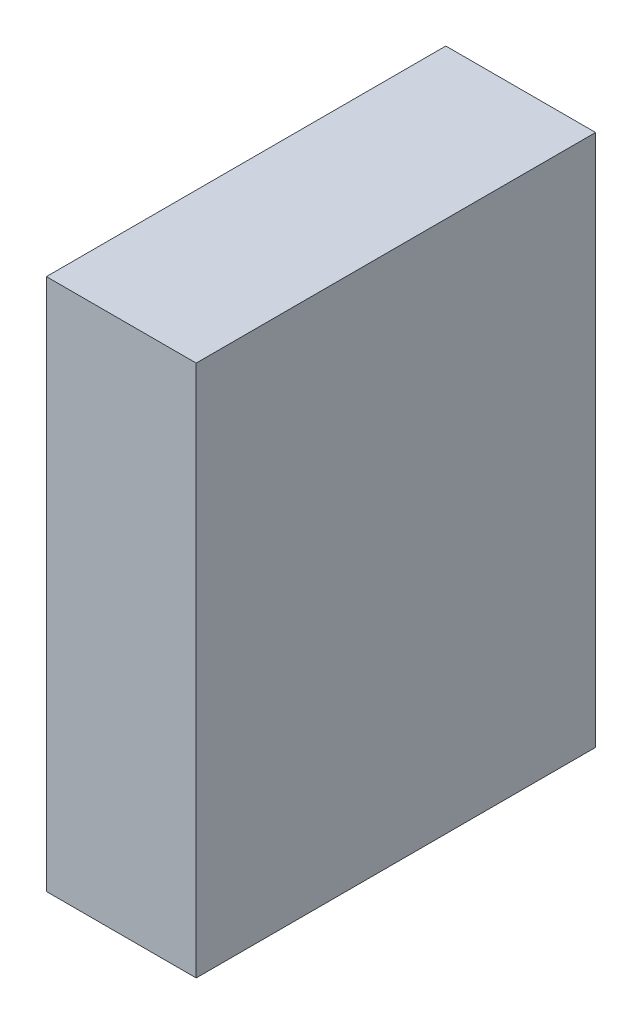
ISO-10303-21;
HEADER;
FILE_DESCRIPTION(('STEP AP214'),'2;1');
FILE_NAME('part.step','',(''),(''),'','','');
FILE_SCHEMA(('AUTOMOTIVE_DESIGN { 1 0 10303 214 1 1 1 1 }'));
ENDSEC;
DATA;
#1=APPLICATION_CONTEXT('core data for automotive mechanical design processes');
#2=APPLICATION_PROTOCOL_DEFINITION('international standard','automotive_design',2000,#1);
#3=PRODUCT_CONTEXT('',#1,'mechanical');
#4=PRODUCT('Part','Part','',(#3));
#5=PRODUCT_RELATED_PRODUCT_CATEGORY('part','',(#4));
#6=PRODUCT_DEFINITION_FORMATION('','',#4);
#7=PRODUCT_DEFINITION_CONTEXT('part definition',#1,'design');
#8=PRODUCT_DEFINITION('design','',#6,#7);
#9=PRODUCT_DEFINITION_SHAPE('','',#8);
#10=(LENGTH_UNIT() NAMED_UNIT(*) SI_UNIT(.MILLI.,.METRE.));
#11=(NAMED_UNIT(*) PLANE_ANGLE_UNIT() SI_UNIT($,.RADIAN.));
#12=(NAMED_UNIT(*) SI_UNIT($,.STERADIAN.) SOLID_ANGLE_UNIT());
#13=UNCERTAINTY_MEASURE_WITH_UNIT(LENGTH_MEASURE(1.E-05),#10,'distance_accuracy_value','');
#14=(GEOMETRIC_REPRESENTATION_CONTEXT(3) GLOBAL_UNCERTAINTY_ASSIGNED_CONTEXT((#13)) GLOBAL_UNIT_ASSIGNED_CONTEXT((#10,
#11,#12)) REPRESENTATION_CONTEXT('',''));
#15=CARTESIAN_POINT('',(0.,0.,0.));
#16=DIRECTION('',(0.,0.,1.));
#17=DIRECTION('',(1.,0.,0.));
#18=AXIS2_PLACEMENT_3D('',#15,#16,#17);
#19=CARTESIAN_POINT('',(2.286,-8.128,0.));
#20=DIRECTION('',(-1.,0.,0.));
#21=DIRECTION('',(0.,0.,1.));
#22=AXIS2_PLACEMENT_3D('',#19,#20,#21);
#23=PLANE('',#22);
#24=DIRECTION('',(0.,0.,-1.));
#25=VECTOR('',#24,1.);
#26=CARTESIAN_POINT('',(2.286,8.128,0.));
#27=LINE('',#26,#25);
#28=CARTESIAN_POINT('',(2.286,8.128,0.));
#29=VERTEX_POINT('',#28);
#30=CARTESIAN_POINT('',(2.286,8.128,12.192));
#31=VERTEX_POINT('',#30);
#32=EDGE_CURVE('E20',#29,#31,#27,.F.);
#33=ORIENTED_EDGE('',*,*,#32,.T.);
#34=DIRECTION('',(0.,1.,0.));
#35=VECTOR('',#34,1.);
#36=CARTESIAN_POINT('',(2.286,8.128,12.192));
#37=LINE('',#36,#35);
#38=CARTESIAN_POINT('',(2.286,-8.128,12.192));
#39=VERTEX_POINT('',#38);
#40=EDGE_CURVE('E55',#31,#39,#37,.F.);
#41=ORIENTED_EDGE('',*,*,#40,.T.);
#42=DIRECTION('',(0.,0.,1.));
#43=VECTOR('',#42,1.);
#44=CARTESIAN_POINT('',(2.286,-8.128,0.));
#45=LINE('',#44,#43);
#46=CARTESIAN_POINT('',(2.286,-8.128,0.));
#47=VERTEX_POINT('',#46);
#48=EDGE_CURVE('E74',#39,#47,#45,.F.);
#49=ORIENTED_EDGE('',*,*,#48,.T.);
#50=DIRECTION('',(0.,1.,0.));
#51=VECTOR('',#50,1.);
#52=CARTESIAN_POINT('',(2.286,8.128,0.));
#53=LINE('',#52,#51);
#54=EDGE_CURVE('E66',#29,#47,#53,.F.);
#55=ORIENTED_EDGE('',*,*,#54,.F.);
#56=EDGE_LOOP('',(#33,#41,#49,#55));
#57=FACE_BOUND('',#56,.T.);
#58=ADVANCED_FACE('F17',(#57),#23,.F.);
#59=CARTESIAN_POINT('',(2.286,8.128,0.));
#60=DIRECTION('',(0.,-1.,0.));
#61=DIRECTION('',(0.,0.,-1.));
#62=AXIS2_PLACEMENT_3D('',#59,#60,#61);
#63=PLANE('',#62);
#64=DIRECTION('',(0.,0.,-1.));
#65=VECTOR('',#64,1.);
#66=CARTESIAN_POINT('',(-2.286,8.128,0.));
#67=LINE('',#66,#65);
#68=CARTESIAN_POINT('',(-2.286,8.128,0.));
#69=VERTEX_POINT('',#68);
#70=CARTESIAN_POINT('',(-2.286,8.128,12.192));
#71=VERTEX_POINT('',#70);
#72=EDGE_CURVE('E72',#69,#71,#67,.F.);
#73=ORIENTED_EDGE('',*,*,#72,.T.);
#74=DIRECTION('',(-1.,0.,0.));
#75=VECTOR('',#74,1.);
#76=CARTESIAN_POINT('',(2.286,8.128,12.192));
#77=LINE('',#76,#75);
#78=EDGE_CURVE('E62',#71,#31,#77,.F.);
#79=ORIENTED_EDGE('',*,*,#78,.T.);
#80=ORIENTED_EDGE('',*,*,#32,.F.);
#81=DIRECTION('',(-1.,0.,0.));
#82=VECTOR('',#81,1.);
#83=CARTESIAN_POINT('',(2.286,8.128,0.));
#84=LINE('',#83,#82);
#85=EDGE_CURVE('E80',#69,#29,#84,.F.);
#86=ORIENTED_EDGE('',*,*,#85,.F.);
#87=EDGE_LOOP('',(#73,#79,#80,#86));
#88=FACE_BOUND('',#87,.T.);
#89=ADVANCED_FACE('F71',(#88),#63,.F.);
#90=CARTESIAN_POINT('',(2.286,8.128,12.192));
#91=DIRECTION('',(0.,0.,-1.));
#92=DIRECTION('',(-1.,0.,0.));
#93=AXIS2_PLACEMENT_3D('',#90,#91,#92);
#94=PLANE('',#93);
#95=DIRECTION('',(0.,1.,0.));
#96=VECTOR('',#95,1.);
#97=CARTESIAN_POINT('',(-2.286,8.128,12.192));
#98=LINE('',#97,#96);
#99=CARTESIAN_POINT('',(-2.286,-8.128,12.192));
#100=VERTEX_POINT('',#99);
#101=EDGE_CURVE('E83',#71,#100,#98,.F.);
#102=ORIENTED_EDGE('',*,*,#101,.T.);
#103=DIRECTION('',(1.,0.,0.));
#104=VECTOR('',#103,1.);
#105=CARTESIAN_POINT('',(-2.286,-8.128,12.192));
#106=LINE('',#105,#104);
#107=EDGE_CURVE('E64',#100,#39,#106,.T.);
#108=ORIENTED_EDGE('',*,*,#107,.T.);
#109=ORIENTED_EDGE('',*,*,#40,.F.);
#110=ORIENTED_EDGE('',*,*,#78,.F.);
#111=EDGE_LOOP('',(#102,#108,#109,#110));
#112=FACE_BOUND('',#111,.T.);
#113=ADVANCED_FACE('F60',(#112),#94,.F.);
#114=CARTESIAN_POINT('',(-2.286,-8.128,0.));
#115=DIRECTION('',(0.,1.,0.));
#116=DIRECTION('',(0.,0.,1.));
#117=AXIS2_PLACEMENT_3D('',#114,#115,#116);
#118=PLANE('',#117);
#119=ORIENTED_EDGE('',*,*,#48,.F.);
#120=ORIENTED_EDGE('',*,*,#107,.F.);
#121=DIRECTION('',(0.,0.,-1.));
#122=VECTOR('',#121,1.);
#123=CARTESIAN_POINT('',(-2.286,-8.128,0.));
#124=LINE('',#123,#122);
#125=CARTESIAN_POINT('',(-2.286,-8.128,0.));
#126=VERTEX_POINT('',#125);
#127=EDGE_CURVE('E26',#100,#126,#124,.T.);
#128=ORIENTED_EDGE('',*,*,#127,.T.);
#129=DIRECTION('',(-1.,0.,0.));
#130=VECTOR('',#129,1.);
#131=CARTESIAN_POINT('',(2.286,-8.128,0.));
#132=LINE('',#131,#130);
#133=EDGE_CURVE('E34',#47,#126,#132,.T.);
#134=ORIENTED_EDGE('',*,*,#133,.F.);
#135=EDGE_LOOP('',(#119,#120,#128,#134));
#136=FACE_BOUND('',#135,.T.);
#137=ADVANCED_FACE('F88',(#136),#118,.F.);
#138=CARTESIAN_POINT('',(2.286,8.128,0.));
#139=DIRECTION('',(0.,0.,-1.));
#140=DIRECTION('',(-1.,0.,0.));
#141=AXIS2_PLACEMENT_3D('',#138,#139,#140);
#142=PLANE('',#141);
#143=DIRECTION('',(0.,1.,0.));
#144=VECTOR('',#143,1.);
#145=CARTESIAN_POINT('',(-2.286,8.128,0.));
#146=LINE('',#145,#144);
#147=EDGE_CURVE('E11',#126,#69,#146,.T.);
#148=ORIENTED_EDGE('',*,*,#147,.T.);
#149=ORIENTED_EDGE('',*,*,#85,.T.);
#150=ORIENTED_EDGE('',*,*,#54,.T.);
#151=ORIENTED_EDGE('',*,*,#133,.T.);
#152=EDGE_LOOP('',(#148,#149,#150,#151));
#153=FACE_BOUND('',#152,.T.);
#154=ADVANCED_FACE('F91',(#153),#142,.T.);
#155=CARTESIAN_POINT('',(-2.286,8.128,0.));
#156=DIRECTION('',(1.,0.,0.));
#157=DIRECTION('',(0.,0.,-1.));
#158=AXIS2_PLACEMENT_3D('',#155,#156,#157);
#159=PLANE('',#158);
#160=ORIENTED_EDGE('',*,*,#127,.F.);
#161=ORIENTED_EDGE('',*,*,#101,.F.);
#162=ORIENTED_EDGE('',*,*,#72,.F.);
#163=ORIENTED_EDGE('',*,*,#147,.F.);
#164=EDGE_LOOP('',(#160,#161,#162,#163));
#165=FACE_BOUND('',#164,.T.);
#166=ADVANCED_FACE('F90',(#165),#159,.F.);
#167=CLOSED_SHELL('',(#58,#89,#113,#137,#154,#166));
#168=MANIFOLD_SOLID_BREP('B1',#167);
#169=ADVANCED_BREP_SHAPE_REPRESENTATION('',(#18,#168),#14);
#170=SHAPE_DEFINITION_REPRESENTATION(#9,#169);
ENDSEC;
END-ISO-10303-21;
